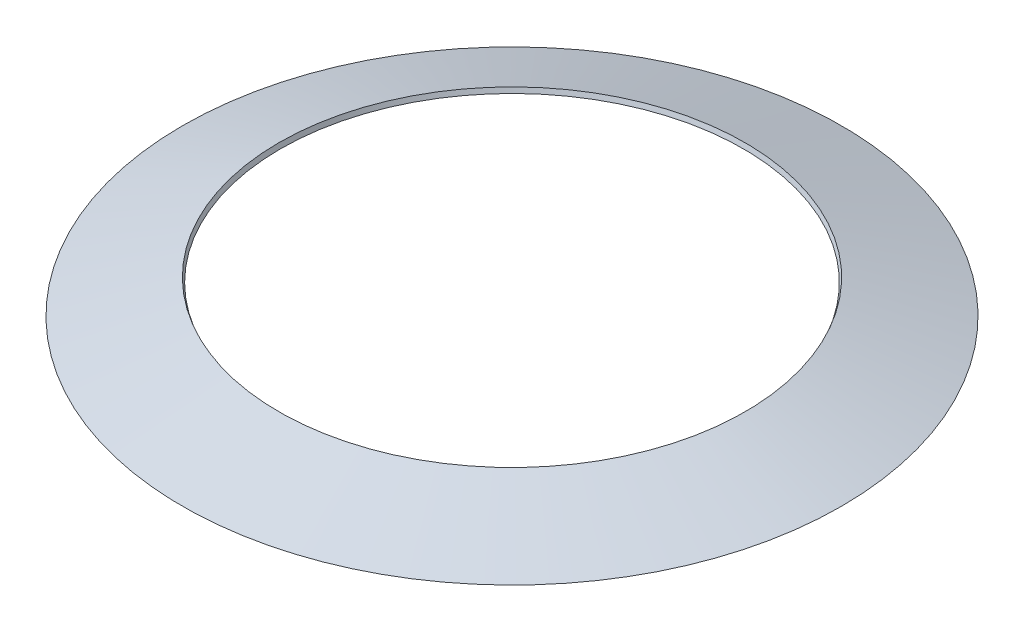
ISO-10303-21;
HEADER;
FILE_DESCRIPTION(('STEP AP214'),'2;1');
FILE_NAME('part.step','',(''),(''),'','','');
FILE_SCHEMA(('AUTOMOTIVE_DESIGN { 1 0 10303 214 1 1 1 1 }'));
ENDSEC;
DATA;
#1=APPLICATION_CONTEXT('core data for automotive mechanical design processes');
#2=APPLICATION_PROTOCOL_DEFINITION('international standard','automotive_design',2000,#1);
#3=PRODUCT_CONTEXT('',#1,'mechanical');
#4=PRODUCT('Part','Part','',(#3));
#5=PRODUCT_RELATED_PRODUCT_CATEGORY('part','',(#4));
#6=PRODUCT_DEFINITION_FORMATION('','',#4);
#7=PRODUCT_DEFINITION_CONTEXT('part definition',#1,'design');
#8=PRODUCT_DEFINITION('design','',#6,#7);
#9=PRODUCT_DEFINITION_SHAPE('','',#8);
#10=(LENGTH_UNIT() NAMED_UNIT(*) SI_UNIT(.MILLI.,.METRE.));
#11=(NAMED_UNIT(*) PLANE_ANGLE_UNIT() SI_UNIT($,.RADIAN.));
#12=(NAMED_UNIT(*) SI_UNIT($,.STERADIAN.) SOLID_ANGLE_UNIT());
#13=UNCERTAINTY_MEASURE_WITH_UNIT(LENGTH_MEASURE(1.E-05),#10,'distance_accuracy_value','');
#14=(GEOMETRIC_REPRESENTATION_CONTEXT(3) GLOBAL_UNCERTAINTY_ASSIGNED_CONTEXT((#13)) GLOBAL_UNIT_ASSIGNED_CONTEXT((#10,
#11,#12)) REPRESENTATION_CONTEXT('',''));
#15=CARTESIAN_POINT('',(0.,0.,0.));
#16=DIRECTION('',(0.,0.,1.));
#17=DIRECTION('',(1.,0.,0.));
#18=AXIS2_PLACEMENT_3D('',#15,#16,#17);
#19=CARTESIAN_POINT('',(0.,17.8198946066388,0.));
#20=DIRECTION('',(0.,-1.,0.));
#21=DIRECTION('',(1.,0.,0.));
#22=AXIS2_PLACEMENT_3D('',#19,#20,#21);
#23=CONICAL_SURFACE('',#22,68.0000000000006,1.23569311041199);
#24=CARTESIAN_POINT('',(0.,24.7510732426696,0.));
#25=DIRECTION('',(0.,1.,0.));
#26=DIRECTION('',(-1.,0.,0.));
#27=AXIS2_PLACEMENT_3D('',#24,#25,#26);
#28=CIRCLE('',#27,48.0963661512157);
#29=CARTESIAN_POINT('',(-48.0963661512157,24.7510732426696,0.));
#30=VERTEX_POINT('',#29);
#31=EDGE_CURVE('E42',#30,#30,#28,.T.);
#32=ORIENTED_EDGE('',*,*,#31,.F.);
#33=EDGE_LOOP('',(#32));
#34=FACE_BOUND('',#33,.T.);
#35=CARTESIAN_POINT('',(0.,17.8198946066388,0.));
#36=DIRECTION('',(0.,1.,0.));
#37=DIRECTION('',(-1.,0.,0.));
#38=AXIS2_PLACEMENT_3D('',#35,#36,#37);
#39=CIRCLE('',#38,68.0000000000006);
#40=CARTESIAN_POINT('',(-68.0000000000006,17.8198946066388,0.));
#41=VERTEX_POINT('',#40);
#42=EDGE_CURVE('E10',#41,#41,#39,.T.);
#43=ORIENTED_EDGE('',*,*,#42,.T.);
#44=EDGE_LOOP('',(#43));
#45=FACE_BOUND('',#44,.T.);
#46=ADVANCED_FACE('F31',(#34,#45),#23,.T.);
#47=CARTESIAN_POINT('',(0.,16.8755182364013,0.));
#48=DIRECTION('',(0.,-1.,0.));
#49=DIRECTION('',(1.,0.,0.));
#50=AXIS2_PLACEMENT_3D('',#47,#48,#49);
#51=CONICAL_SURFACE('',#50,67.671133353262,1.23569311041199);
#52=CARTESIAN_POINT('',(0.,17.8198946066388,0.));
#53=DIRECTION('',(0.,1.,0.));
#54=DIRECTION('',(0.,0.,1.));
#55=AXIS2_PLACEMENT_3D('',#52,#53,#54);
#56=CIRCLE('',#55,64.9592538193916);
#57=CARTESIAN_POINT('',(0.,17.8198946066388,64.9592538193917));
#58=VERTEX_POINT('',#57);
#59=EDGE_CURVE('E34',#58,#58,#56,.T.);
#60=ORIENTED_EDGE('',*,*,#59,.F.);
#61=EDGE_LOOP('',(#60));
#62=FACE_BOUND('',#61,.T.);
#63=CARTESIAN_POINT('',(0.,23.8066968724321,0.));
#64=DIRECTION('',(0.,1.,0.));
#65=DIRECTION('',(-1.,0.,0.));
#66=AXIS2_PLACEMENT_3D('',#63,#64,#65);
#67=CIRCLE('',#66,47.7674995044771);
#68=CARTESIAN_POINT('',(-47.7674995044771,23.8066968724321,0.));
#69=VERTEX_POINT('',#68);
#70=EDGE_CURVE('E38',#69,#69,#67,.T.);
#71=ORIENTED_EDGE('',*,*,#70,.T.);
#72=EDGE_LOOP('',(#71));
#73=FACE_BOUND('',#72,.T.);
#74=ADVANCED_FACE('F53',(#62,#73),#51,.F.);
#75=CARTESIAN_POINT('',(0.,23.8066968724321,0.));
#76=DIRECTION('',(0.,1.,0.));
#77=DIRECTION('',(-1.,0.,0.));
#78=AXIS2_PLACEMENT_3D('',#75,#76,#77);
#79=CONICAL_SURFACE('',#78,47.7674995044771,0.335103216382906);
#80=ORIENTED_EDGE('',*,*,#31,.T.);
#81=EDGE_LOOP('',(#80));
#82=FACE_BOUND('',#81,.T.);
#83=ORIENTED_EDGE('',*,*,#70,.F.);
#84=EDGE_LOOP('',(#83));
#85=FACE_BOUND('',#84,.T.);
#86=ADVANCED_FACE('F56',(#82,#85),#79,.F.);
#87=CARTESIAN_POINT('',(-68.0000000000006,17.8198946066388,-68.0000000000006));
#88=DIRECTION('',(0.,1.,0.));
#89=DIRECTION('',(0.,0.,1.));
#90=AXIS2_PLACEMENT_3D('',#87,#88,#89);
#91=PLANE('',#90);
#92=ORIENTED_EDGE('',*,*,#42,.F.);
#93=EDGE_LOOP('',(#92));
#94=FACE_BOUND('',#93,.T.);
#95=ORIENTED_EDGE('',*,*,#59,.T.);
#96=EDGE_LOOP('',(#95));
#97=FACE_BOUND('',#96,.T.);
#98=ADVANCED_FACE('F51',(#94,#97),#91,.F.);
#99=CLOSED_SHELL('',(#46,#74,#86,#98));
#100=MANIFOLD_SOLID_BREP('B2',#99);
#101=ADVANCED_BREP_SHAPE_REPRESENTATION('',(#18,#100),#14);
#102=SHAPE_DEFINITION_REPRESENTATION(#9,#101);
ENDSEC;
END-ISO-10303-21;
